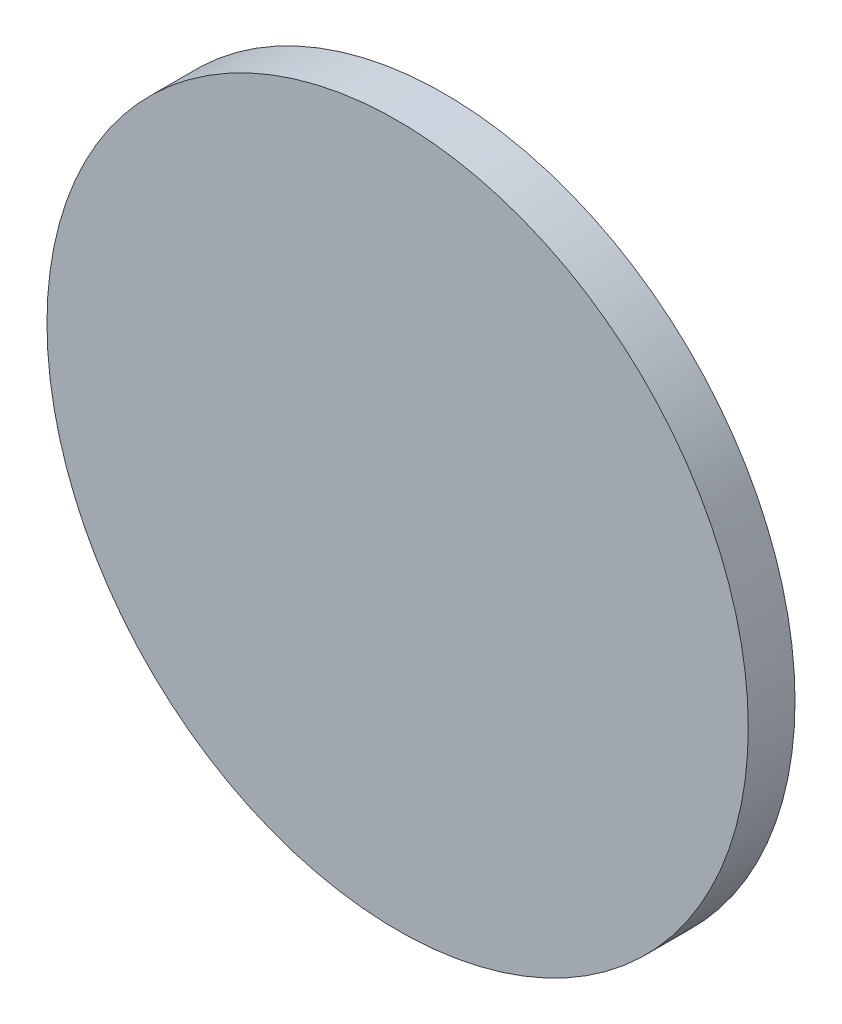
ISO-10303-21;
HEADER;
FILE_DESCRIPTION(('STEP AP214'),'2;1');
FILE_NAME('part.step','',(''),(''),'','','');
FILE_SCHEMA(('AUTOMOTIVE_DESIGN { 1 0 10303 214 1 1 1 1 }'));
ENDSEC;
DATA;
#1=APPLICATION_CONTEXT('core data for automotive mechanical design processes');
#2=APPLICATION_PROTOCOL_DEFINITION('international standard','automotive_design',2000,#1);
#3=PRODUCT_CONTEXT('',#1,'mechanical');
#4=PRODUCT('Part','Part','',(#3));
#5=PRODUCT_RELATED_PRODUCT_CATEGORY('part','',(#4));
#6=PRODUCT_DEFINITION_FORMATION('','',#4);
#7=PRODUCT_DEFINITION_CONTEXT('part definition',#1,'design');
#8=PRODUCT_DEFINITION('design','',#6,#7);
#9=PRODUCT_DEFINITION_SHAPE('','',#8);
#10=(LENGTH_UNIT() NAMED_UNIT(*) SI_UNIT(.MILLI.,.METRE.));
#11=(NAMED_UNIT(*) PLANE_ANGLE_UNIT() SI_UNIT($,.RADIAN.));
#12=(NAMED_UNIT(*) SI_UNIT($,.STERADIAN.) SOLID_ANGLE_UNIT());
#13=UNCERTAINTY_MEASURE_WITH_UNIT(LENGTH_MEASURE(1.E-05),#10,'distance_accuracy_value','');
#14=(GEOMETRIC_REPRESENTATION_CONTEXT(3) GLOBAL_UNCERTAINTY_ASSIGNED_CONTEXT((#13)) GLOBAL_UNIT_ASSIGNED_CONTEXT((#10,
#11,#12)) REPRESENTATION_CONTEXT('',''));
#15=CARTESIAN_POINT('',(0.,0.,0.));
#16=DIRECTION('',(0.,0.,1.));
#17=DIRECTION('',(1.,0.,0.));
#18=AXIS2_PLACEMENT_3D('',#15,#16,#17);
#19=CARTESIAN_POINT('',(0.,0.,10.));
#20=DIRECTION('',(0.,0.,-1.));
#21=DIRECTION('',(-1.,0.,0.));
#22=AXIS2_PLACEMENT_3D('',#19,#20,#21);
#23=CYLINDRICAL_SURFACE('',#22,75.);
#24=CARTESIAN_POINT('',(0.,0.,10.));
#25=DIRECTION('',(0.,0.,1.));
#26=DIRECTION('',(1.,0.,0.));
#27=AXIS2_PLACEMENT_3D('',#24,#25,#26);
#28=CIRCLE('',#27,75.);
#29=CARTESIAN_POINT('',(75.,0.,10.));
#30=VERTEX_POINT('',#29);
#31=EDGE_CURVE('E10',#30,#30,#28,.T.);
#32=ORIENTED_EDGE('',*,*,#31,.F.);
#33=EDGE_LOOP('',(#32));
#34=FACE_BOUND('',#33,.T.);
#35=CARTESIAN_POINT('',(0.,0.,0.));
#36=DIRECTION('',(0.,0.,1.));
#37=DIRECTION('',(1.,0.,0.));
#38=AXIS2_PLACEMENT_3D('',#35,#36,#37);
#39=CIRCLE('',#38,75.);
#40=CARTESIAN_POINT('',(75.,0.,0.));
#41=VERTEX_POINT('',#40);
#42=EDGE_CURVE('E34',#41,#41,#39,.T.);
#43=ORIENTED_EDGE('',*,*,#42,.T.);
#44=EDGE_LOOP('',(#43));
#45=FACE_BOUND('',#44,.T.);
#46=ADVANCED_FACE('F31',(#34,#45),#23,.T.);
#47=CARTESIAN_POINT('',(0.,0.,10.));
#48=DIRECTION('',(0.,0.,1.));
#49=DIRECTION('',(1.,0.,0.));
#50=AXIS2_PLACEMENT_3D('',#47,#48,#49);
#51=PLANE('',#50);
#52=ORIENTED_EDGE('',*,*,#31,.T.);
#53=EDGE_LOOP('',(#52));
#54=FACE_BOUND('',#53,.T.);
#55=ADVANCED_FACE('F46',(#54),#51,.T.);
#56=CARTESIAN_POINT('',(0.,0.,0.));
#57=DIRECTION('',(0.,0.,1.));
#58=DIRECTION('',(1.,0.,0.));
#59=AXIS2_PLACEMENT_3D('',#56,#57,#58);
#60=PLANE('',#59);
#61=ORIENTED_EDGE('',*,*,#42,.F.);
#62=EDGE_LOOP('',(#61));
#63=FACE_BOUND('',#62,.T.);
#64=ADVANCED_FACE('F44',(#63),#60,.F.);
#65=CLOSED_SHELL('',(#46,#55,#64));
#66=MANIFOLD_SOLID_BREP('B2',#65);
#67=ADVANCED_BREP_SHAPE_REPRESENTATION('',(#18,#66),#14);
#68=SHAPE_DEFINITION_REPRESENTATION(#9,#67);
ENDSEC;
END-ISO-10303-21;
